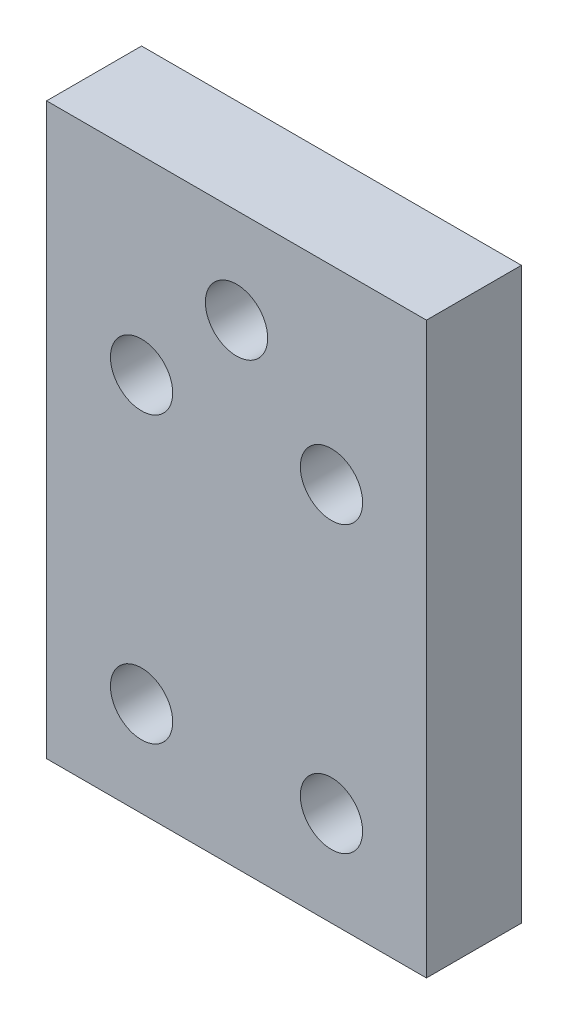
ISO-10303-21;
HEADER;
FILE_DESCRIPTION(('STEP AP214'),'2;1');
FILE_NAME('part.step','',(''),(''),'','','');
FILE_SCHEMA(('AUTOMOTIVE_DESIGN { 1 0 10303 214 1 1 1 1 }'));
ENDSEC;
DATA;
#1=APPLICATION_CONTEXT('core data for automotive mechanical design processes');
#2=APPLICATION_PROTOCOL_DEFINITION('international standard','automotive_design',2000,#1);
#3=PRODUCT_CONTEXT('',#1,'mechanical');
#4=PRODUCT('Part','Part','',(#3));
#5=PRODUCT_RELATED_PRODUCT_CATEGORY('part','',(#4));
#6=PRODUCT_DEFINITION_FORMATION('','',#4);
#7=PRODUCT_DEFINITION_CONTEXT('part definition',#1,'design');
#8=PRODUCT_DEFINITION('design','',#6,#7);
#9=PRODUCT_DEFINITION_SHAPE('','',#8);
#10=(LENGTH_UNIT() NAMED_UNIT(*) SI_UNIT(.MILLI.,.METRE.));
#11=(NAMED_UNIT(*) PLANE_ANGLE_UNIT() SI_UNIT($,.RADIAN.));
#12=(NAMED_UNIT(*) SI_UNIT($,.STERADIAN.) SOLID_ANGLE_UNIT());
#13=UNCERTAINTY_MEASURE_WITH_UNIT(LENGTH_MEASURE(1.E-05),#10,'distance_accuracy_value','');
#14=(GEOMETRIC_REPRESENTATION_CONTEXT(3) GLOBAL_UNCERTAINTY_ASSIGNED_CONTEXT((#13)) GLOBAL_UNIT_ASSIGNED_CONTEXT((#10,
#11,#12)) REPRESENTATION_CONTEXT('',''));
#15=CARTESIAN_POINT('',(0.,0.,0.));
#16=DIRECTION('',(0.,0.,1.));
#17=DIRECTION('',(1.,0.,0.));
#18=AXIS2_PLACEMENT_3D('',#15,#16,#17);
#19=CARTESIAN_POINT('',(0.,0.,6.35));
#20=DIRECTION('',(0.,0.,-1.));
#21=DIRECTION('',(-1.,0.,0.));
#22=AXIS2_PLACEMENT_3D('',#19,#20,#21);
#23=PLANE('',#22);
#24=DIRECTION('',(-1.,0.,0.));
#25=VECTOR('',#24,1.);
#26=CARTESIAN_POINT('',(0.,50.8,6.35));
#27=LINE('',#26,#25);
#28=CARTESIAN_POINT('',(25.4,50.8,6.35));
#29=VERTEX_POINT('',#28);
#30=CARTESIAN_POINT('',(0.,50.8,6.35));
#31=VERTEX_POINT('',#30);
#32=EDGE_CURVE('E85',#29,#31,#27,.T.);
#33=ORIENTED_EDGE('',*,*,#32,.T.);
#34=DIRECTION('',(0.,-1.,0.));
#35=VECTOR('',#34,1.);
#36=CARTESIAN_POINT('',(0.,12.7,6.35));
#37=LINE('',#36,#35);
#38=CARTESIAN_POINT('',(0.,12.7,6.35));
#39=VERTEX_POINT('',#38);
#40=EDGE_CURVE('E80',#31,#39,#37,.T.);
#41=ORIENTED_EDGE('',*,*,#40,.T.);
#42=DIRECTION('',(1.,0.,0.));
#43=VECTOR('',#42,1.);
#44=CARTESIAN_POINT('',(25.4,12.7,6.35));
#45=LINE('',#44,#43);
#46=CARTESIAN_POINT('',(25.4,12.7,6.35));
#47=VERTEX_POINT('',#46);
#48=EDGE_CURVE('E83',#39,#47,#45,.T.);
#49=ORIENTED_EDGE('',*,*,#48,.T.);
#50=DIRECTION('',(0.,1.,0.));
#51=VECTOR('',#50,1.);
#52=CARTESIAN_POINT('',(25.4,50.8,6.35));
#53=LINE('',#52,#51);
#54=EDGE_CURVE('E50',#47,#29,#53,.T.);
#55=ORIENTED_EDGE('',*,*,#54,.T.);
#56=EDGE_LOOP('',(#33,#41,#49,#55));
#57=FACE_BOUND('',#56,.T.);
#58=CARTESIAN_POINT('',(6.35,38.1,6.35));
#59=DIRECTION('',(0.,0.,1.));
#60=DIRECTION('',(1.,0.,0.));
#61=AXIS2_PLACEMENT_3D('',#58,#59,#60);
#62=CIRCLE('',#61,2.0828);
#63=CARTESIAN_POINT('',(8.4328,38.1,6.35));
#64=VERTEX_POINT('',#63);
#65=EDGE_CURVE('E100',#64,#64,#62,.T.);
#66=ORIENTED_EDGE('',*,*,#65,.F.);
#67=EDGE_LOOP('',(#66));
#68=FACE_BOUND('',#67,.T.);
#69=CARTESIAN_POINT('',(19.05,38.1,6.35));
#70=DIRECTION('',(0.,0.,1.));
#71=DIRECTION('',(-1.,0.,0.));
#72=AXIS2_PLACEMENT_3D('',#69,#70,#71);
#73=CIRCLE('',#72,2.0828);
#74=CARTESIAN_POINT('',(16.9672,38.1,6.35));
#75=VERTEX_POINT('',#74);
#76=EDGE_CURVE('E115',#75,#75,#73,.T.);
#77=ORIENTED_EDGE('',*,*,#76,.F.);
#78=EDGE_LOOP('',(#77));
#79=FACE_BOUND('',#78,.T.);
#80=CARTESIAN_POINT('',(6.35,19.05,6.35));
#81=DIRECTION('',(0.,0.,1.));
#82=DIRECTION('',(1.,0.,0.));
#83=AXIS2_PLACEMENT_3D('',#80,#81,#82);
#84=CIRCLE('',#83,2.0828);
#85=CARTESIAN_POINT('',(8.4328,19.05,6.35));
#86=VERTEX_POINT('',#85);
#87=EDGE_CURVE('E121',#86,#86,#84,.T.);
#88=ORIENTED_EDGE('',*,*,#87,.F.);
#89=EDGE_LOOP('',(#88));
#90=FACE_BOUND('',#89,.T.);
#91=CARTESIAN_POINT('',(12.7,44.45,6.35));
#92=DIRECTION('',(0.,0.,1.));
#93=DIRECTION('',(1.,0.,0.));
#94=AXIS2_PLACEMENT_3D('',#91,#92,#93);
#95=CIRCLE('',#94,2.0828);
#96=CARTESIAN_POINT('',(14.7828,44.45,6.35));
#97=VERTEX_POINT('',#96);
#98=EDGE_CURVE('E127',#97,#97,#95,.T.);
#99=ORIENTED_EDGE('',*,*,#98,.F.);
#100=EDGE_LOOP('',(#99));
#101=FACE_BOUND('',#100,.T.);
#102=CARTESIAN_POINT('',(19.05,19.05,6.35));
#103=DIRECTION('',(0.,0.,1.));
#104=DIRECTION('',(-1.,0.,0.));
#105=AXIS2_PLACEMENT_3D('',#102,#103,#104);
#106=CIRCLE('',#105,2.0828);
#107=CARTESIAN_POINT('',(16.9672,19.05,6.35));
#108=VERTEX_POINT('',#107);
#109=EDGE_CURVE('E133',#108,#108,#106,.T.);
#110=ORIENTED_EDGE('',*,*,#109,.F.);
#111=EDGE_LOOP('',(#110));
#112=FACE_BOUND('',#111,.T.);
#113=ADVANCED_FACE('F33',(#57,#68,#79,#90,#101,#112),#23,.F.);
#114=CARTESIAN_POINT('',(0.,0.,0.));
#115=DIRECTION('',(0.,0.,-1.));
#116=DIRECTION('',(-1.,0.,0.));
#117=AXIS2_PLACEMENT_3D('',#114,#115,#116);
#118=PLANE('',#117);
#119=CARTESIAN_POINT('',(12.7,44.45,0.));
#120=DIRECTION('',(0.,0.,1.));
#121=DIRECTION('',(1.,0.,0.));
#122=AXIS2_PLACEMENT_3D('',#119,#120,#121);
#123=CIRCLE('',#122,2.0828);
#124=CARTESIAN_POINT('',(14.7828,44.45,0.));
#125=VERTEX_POINT('',#124);
#126=EDGE_CURVE('E130',#125,#125,#123,.T.);
#127=ORIENTED_EDGE('',*,*,#126,.T.);
#128=EDGE_LOOP('',(#127));
#129=FACE_BOUND('',#128,.T.);
#130=CARTESIAN_POINT('',(19.05,38.1,0.));
#131=DIRECTION('',(0.,0.,1.));
#132=DIRECTION('',(-1.,0.,0.));
#133=AXIS2_PLACEMENT_3D('',#130,#131,#132);
#134=CIRCLE('',#133,2.0828);
#135=CARTESIAN_POINT('',(16.9672,38.1,0.));
#136=VERTEX_POINT('',#135);
#137=EDGE_CURVE('E118',#136,#136,#134,.T.);
#138=ORIENTED_EDGE('',*,*,#137,.T.);
#139=EDGE_LOOP('',(#138));
#140=FACE_BOUND('',#139,.T.);
#141=DIRECTION('',(-1.,0.,0.));
#142=VECTOR('',#141,1.);
#143=CARTESIAN_POINT('',(0.,50.8,0.));
#144=LINE('',#143,#142);
#145=CARTESIAN_POINT('',(25.4,50.8,0.));
#146=VERTEX_POINT('',#145);
#147=CARTESIAN_POINT('',(0.,50.8,0.));
#148=VERTEX_POINT('',#147);
#149=EDGE_CURVE('E97',#146,#148,#144,.T.);
#150=ORIENTED_EDGE('',*,*,#149,.F.);
#151=DIRECTION('',(0.,1.,0.));
#152=VECTOR('',#151,1.);
#153=CARTESIAN_POINT('',(25.4,50.8,0.));
#154=LINE('',#153,#152);
#155=CARTESIAN_POINT('',(25.4,12.7,0.));
#156=VERTEX_POINT('',#155);
#157=EDGE_CURVE('E73',#156,#146,#154,.T.);
#158=ORIENTED_EDGE('',*,*,#157,.F.);
#159=DIRECTION('',(1.,0.,0.));
#160=VECTOR('',#159,1.);
#161=CARTESIAN_POINT('',(25.4,12.7,0.));
#162=LINE('',#161,#160);
#163=CARTESIAN_POINT('',(0.,12.7,0.));
#164=VERTEX_POINT('',#163);
#165=EDGE_CURVE('E67',#164,#156,#162,.T.);
#166=ORIENTED_EDGE('',*,*,#165,.F.);
#167=DIRECTION('',(0.,-1.,0.));
#168=VECTOR('',#167,1.);
#169=CARTESIAN_POINT('',(0.,12.7,0.));
#170=LINE('',#169,#168);
#171=EDGE_CURVE('E89',#148,#164,#170,.T.);
#172=ORIENTED_EDGE('',*,*,#171,.F.);
#173=EDGE_LOOP('',(#150,#158,#166,#172));
#174=FACE_BOUND('',#173,.T.);
#175=CARTESIAN_POINT('',(6.35,38.1,0.));
#176=DIRECTION('',(0.,0.,1.));
#177=DIRECTION('',(1.,0.,0.));
#178=AXIS2_PLACEMENT_3D('',#175,#176,#177);
#179=CIRCLE('',#178,2.0828);
#180=CARTESIAN_POINT('',(8.4328,38.1,0.));
#181=VERTEX_POINT('',#180);
#182=EDGE_CURVE('E112',#181,#181,#179,.T.);
#183=ORIENTED_EDGE('',*,*,#182,.T.);
#184=EDGE_LOOP('',(#183));
#185=FACE_BOUND('',#184,.T.);
#186=CARTESIAN_POINT('',(6.35,19.05,0.));
#187=DIRECTION('',(0.,0.,1.));
#188=DIRECTION('',(1.,0.,0.));
#189=AXIS2_PLACEMENT_3D('',#186,#187,#188);
#190=CIRCLE('',#189,2.0828);
#191=CARTESIAN_POINT('',(8.4328,19.05,0.));
#192=VERTEX_POINT('',#191);
#193=EDGE_CURVE('E124',#192,#192,#190,.T.);
#194=ORIENTED_EDGE('',*,*,#193,.T.);
#195=EDGE_LOOP('',(#194));
#196=FACE_BOUND('',#195,.T.);
#197=CARTESIAN_POINT('',(19.05,19.05,0.));
#198=DIRECTION('',(0.,0.,1.));
#199=DIRECTION('',(-1.,0.,0.));
#200=AXIS2_PLACEMENT_3D('',#197,#198,#199);
#201=CIRCLE('',#200,2.0828);
#202=CARTESIAN_POINT('',(16.9672,19.05,0.));
#203=VERTEX_POINT('',#202);
#204=EDGE_CURVE('E136',#203,#203,#201,.T.);
#205=ORIENTED_EDGE('',*,*,#204,.T.);
#206=EDGE_LOOP('',(#205));
#207=FACE_BOUND('',#206,.T.);
#208=ADVANCED_FACE('F108',(#129,#140,#174,#185,#196,#207),#118,.T.);
#209=CARTESIAN_POINT('',(0.,50.8,6.35));
#210=DIRECTION('',(0.,-1.,0.));
#211=DIRECTION('',(0.,0.,-1.));
#212=AXIS2_PLACEMENT_3D('',#209,#210,#211);
#213=PLANE('',#212);
#214=ORIENTED_EDGE('',*,*,#149,.T.);
#215=DIRECTION('',(0.,0.,-1.));
#216=VECTOR('',#215,1.);
#217=CARTESIAN_POINT('',(0.,50.8,6.35));
#218=LINE('',#217,#216);
#219=EDGE_CURVE('E11',#31,#148,#218,.T.);
#220=ORIENTED_EDGE('',*,*,#219,.F.);
#221=ORIENTED_EDGE('',*,*,#32,.F.);
#222=DIRECTION('',(0.,0.,-1.));
#223=VECTOR('',#222,1.);
#224=CARTESIAN_POINT('',(25.4,50.8,6.35));
#225=LINE('',#224,#223);
#226=EDGE_CURVE('E93',#29,#146,#225,.T.);
#227=ORIENTED_EDGE('',*,*,#226,.T.);
#228=EDGE_LOOP('',(#214,#220,#221,#227));
#229=FACE_BOUND('',#228,.T.);
#230=ADVANCED_FACE('F35',(#229),#213,.F.);
#231=CARTESIAN_POINT('',(0.,12.7,6.35));
#232=DIRECTION('',(1.,0.,0.));
#233=DIRECTION('',(0.,0.,-1.));
#234=AXIS2_PLACEMENT_3D('',#231,#232,#233);
#235=PLANE('',#234);
#236=ORIENTED_EDGE('',*,*,#171,.T.);
#237=DIRECTION('',(0.,0.,-1.));
#238=VECTOR('',#237,1.);
#239=CARTESIAN_POINT('',(0.,12.7,6.35));
#240=LINE('',#239,#238);
#241=EDGE_CURVE('E42',#39,#164,#240,.T.);
#242=ORIENTED_EDGE('',*,*,#241,.F.);
#243=ORIENTED_EDGE('',*,*,#40,.F.);
#244=ORIENTED_EDGE('',*,*,#219,.T.);
#245=EDGE_LOOP('',(#236,#242,#243,#244));
#246=FACE_BOUND('',#245,.T.);
#247=ADVANCED_FACE('F88',(#246),#235,.F.);
#248=CARTESIAN_POINT('',(25.4,12.7,6.35));
#249=DIRECTION('',(0.,1.,0.));
#250=DIRECTION('',(0.,0.,1.));
#251=AXIS2_PLACEMENT_3D('',#248,#249,#250);
#252=PLANE('',#251);
#253=CARTESIAN_POINT('',(5.334,12.7,3.175));
#254=DIRECTION('',(0.,-1.,0.));
#255=DIRECTION('',(0.,0.,-1.));
#256=AXIS2_PLACEMENT_3D('',#253,#254,#255);
#257=CIRCLE('',#256,0.635000000000001);
#258=CARTESIAN_POINT('',(5.334,12.7,2.54));
#259=VERTEX_POINT('',#258);
#260=EDGE_CURVE('E148',#259,#259,#257,.T.);
#261=ORIENTED_EDGE('',*,*,#260,.F.);
#262=EDGE_LOOP('',(#261));
#263=FACE_BOUND('',#262,.T.);
#264=CARTESIAN_POINT('',(20.066,12.7,3.175));
#265=DIRECTION('',(0.,-1.,0.));
#266=DIRECTION('',(0.,0.,1.));
#267=AXIS2_PLACEMENT_3D('',#264,#265,#266);
#268=CIRCLE('',#267,0.635000000000002);
#269=CARTESIAN_POINT('',(20.066,12.7,3.81));
#270=VERTEX_POINT('',#269);
#271=EDGE_CURVE('E142',#270,#270,#268,.T.);
#272=ORIENTED_EDGE('',*,*,#271,.F.);
#273=EDGE_LOOP('',(#272));
#274=FACE_BOUND('',#273,.T.);
#275=ORIENTED_EDGE('',*,*,#165,.T.);
#276=DIRECTION('',(0.,0.,-1.));
#277=VECTOR('',#276,1.);
#278=CARTESIAN_POINT('',(25.4,12.7,6.35));
#279=LINE('',#278,#277);
#280=EDGE_CURVE('E90',#47,#156,#279,.T.);
#281=ORIENTED_EDGE('',*,*,#280,.F.);
#282=ORIENTED_EDGE('',*,*,#48,.F.);
#283=ORIENTED_EDGE('',*,*,#241,.T.);
#284=EDGE_LOOP('',(#275,#281,#282,#283));
#285=FACE_BOUND('',#284,.T.);
#286=ADVANCED_FACE('F91',(#263,#274,#285),#252,.F.);
#287=CARTESIAN_POINT('',(25.4,50.8,6.35));
#288=DIRECTION('',(-1.,0.,0.));
#289=DIRECTION('',(0.,-1.,0.));
#290=AXIS2_PLACEMENT_3D('',#287,#288,#289);
#291=PLANE('',#290);
#292=ORIENTED_EDGE('',*,*,#157,.T.);
#293=ORIENTED_EDGE('',*,*,#226,.F.);
#294=ORIENTED_EDGE('',*,*,#54,.F.);
#295=ORIENTED_EDGE('',*,*,#280,.T.);
#296=EDGE_LOOP('',(#292,#293,#294,#295));
#297=FACE_BOUND('',#296,.T.);
#298=ADVANCED_FACE('F105',(#297),#291,.F.);
#299=CARTESIAN_POINT('',(6.35,38.1,6.35));
#300=DIRECTION('',(0.,0.,-1.));
#301=DIRECTION('',(-1.,0.,0.));
#302=AXIS2_PLACEMENT_3D('',#299,#300,#301);
#303=CYLINDRICAL_SURFACE('',#302,2.0828);
#304=ORIENTED_EDGE('',*,*,#65,.T.);
#305=EDGE_LOOP('',(#304));
#306=FACE_BOUND('',#305,.T.);
#307=ORIENTED_EDGE('',*,*,#182,.F.);
#308=EDGE_LOOP('',(#307));
#309=FACE_BOUND('',#308,.T.);
#310=ADVANCED_FACE('F191',(#306,#309),#303,.F.);
#311=CARTESIAN_POINT('',(19.05,38.1,6.35));
#312=DIRECTION('',(0.,0.,-1.));
#313=DIRECTION('',(-1.,0.,0.));
#314=AXIS2_PLACEMENT_3D('',#311,#312,#313);
#315=CYLINDRICAL_SURFACE('',#314,2.0828);
#316=ORIENTED_EDGE('',*,*,#76,.T.);
#317=EDGE_LOOP('',(#316));
#318=FACE_BOUND('',#317,.T.);
#319=ORIENTED_EDGE('',*,*,#137,.F.);
#320=EDGE_LOOP('',(#319));
#321=FACE_BOUND('',#320,.T.);
#322=ADVANCED_FACE('F236',(#318,#321),#315,.F.);
#323=CARTESIAN_POINT('',(6.35,19.05,6.35));
#324=DIRECTION('',(0.,0.,-1.));
#325=DIRECTION('',(-1.,0.,0.));
#326=AXIS2_PLACEMENT_3D('',#323,#324,#325);
#327=CYLINDRICAL_SURFACE('',#326,2.0828);
#328=ORIENTED_EDGE('',*,*,#87,.T.);
#329=EDGE_LOOP('',(#328));
#330=FACE_BOUND('',#329,.T.);
#331=ORIENTED_EDGE('',*,*,#193,.F.);
#332=EDGE_LOOP('',(#331));
#333=FACE_BOUND('',#332,.T.);
#334=ADVANCED_FACE('F244',(#330,#333),#327,.F.);
#335=CARTESIAN_POINT('',(12.7,44.45,6.35));
#336=DIRECTION('',(0.,0.,-1.));
#337=DIRECTION('',(-1.,0.,0.));
#338=AXIS2_PLACEMENT_3D('',#335,#336,#337);
#339=CYLINDRICAL_SURFACE('',#338,2.0828);
#340=ORIENTED_EDGE('',*,*,#98,.T.);
#341=EDGE_LOOP('',(#340));
#342=FACE_BOUND('',#341,.T.);
#343=ORIENTED_EDGE('',*,*,#126,.F.);
#344=EDGE_LOOP('',(#343));
#345=FACE_BOUND('',#344,.T.);
#346=ADVANCED_FACE('F179',(#342,#345),#339,.F.);
#347=CARTESIAN_POINT('',(19.05,19.05,6.35));
#348=DIRECTION('',(0.,0.,-1.));
#349=DIRECTION('',(-1.,0.,0.));
#350=AXIS2_PLACEMENT_3D('',#347,#348,#349);
#351=CYLINDRICAL_SURFACE('',#350,2.0828);
#352=ORIENTED_EDGE('',*,*,#109,.T.);
#353=EDGE_LOOP('',(#352));
#354=FACE_BOUND('',#353,.T.);
#355=ORIENTED_EDGE('',*,*,#204,.F.);
#356=EDGE_LOOP('',(#355));
#357=FACE_BOUND('',#356,.T.);
#358=ADVANCED_FACE('F170',(#354,#357),#351,.F.);
#359=CARTESIAN_POINT('',(20.066,16.256,3.175));
#360=DIRECTION('',(0.,-1.,0.));
#361=DIRECTION('',(0.,0.,-1.));
#362=AXIS2_PLACEMENT_3D('',#359,#360,#361);
#363=CYLINDRICAL_SURFACE('',#362,0.635000000000002);
#364=CARTESIAN_POINT('',(20.066,16.256,3.175));
#365=DIRECTION('',(0.,-1.,0.));
#366=DIRECTION('',(0.,0.,1.));
#367=AXIS2_PLACEMENT_3D('',#364,#365,#366);
#368=CIRCLE('',#367,0.635000000000002);
#369=CARTESIAN_POINT('',(20.066,16.256,3.81));
#370=VERTEX_POINT('',#369);
#371=EDGE_CURVE('E139',#370,#370,#368,.T.);
#372=ORIENTED_EDGE('',*,*,#371,.F.);
#373=EDGE_LOOP('',(#372));
#374=FACE_BOUND('',#373,.T.);
#375=ORIENTED_EDGE('',*,*,#271,.T.);
#376=EDGE_LOOP('',(#375));
#377=FACE_BOUND('',#376,.T.);
#378=ADVANCED_FACE('F168',(#374,#377),#363,.F.);
#379=CARTESIAN_POINT('',(20.066,16.256,3.175));
#380=DIRECTION('',(0.,1.,0.));
#381=DIRECTION('',(0.,0.,1.));
#382=AXIS2_PLACEMENT_3D('',#379,#380,#381);
#383=PLANE('',#382);
#384=ORIENTED_EDGE('',*,*,#371,.T.);
#385=EDGE_LOOP('',(#384));
#386=FACE_BOUND('',#385,.T.);
#387=ADVANCED_FACE('F159',(#386),#383,.F.);
#388=CARTESIAN_POINT('',(5.334,16.256,3.175));
#389=DIRECTION('',(0.,-1.,0.));
#390=DIRECTION('',(0.,0.,-1.));
#391=AXIS2_PLACEMENT_3D('',#388,#389,#390);
#392=CYLINDRICAL_SURFACE('',#391,0.635000000000001);
#393=CARTESIAN_POINT('',(5.334,16.256,3.175));
#394=DIRECTION('',(0.,-1.,0.));
#395=DIRECTION('',(0.,0.,-1.));
#396=AXIS2_PLACEMENT_3D('',#393,#394,#395);
#397=CIRCLE('',#396,0.635000000000001);
#398=CARTESIAN_POINT('',(5.334,16.256,2.54));
#399=VERTEX_POINT('',#398);
#400=EDGE_CURVE('E145',#399,#399,#397,.T.);
#401=ORIENTED_EDGE('',*,*,#400,.F.);
#402=EDGE_LOOP('',(#401));
#403=FACE_BOUND('',#402,.T.);
#404=ORIENTED_EDGE('',*,*,#260,.T.);
#405=EDGE_LOOP('',(#404));
#406=FACE_BOUND('',#405,.T.);
#407=ADVANCED_FACE('F156',(#403,#406),#392,.F.);
#408=CARTESIAN_POINT('',(5.334,16.256,3.175));
#409=DIRECTION('',(0.,-1.,0.));
#410=DIRECTION('',(0.,0.,-1.));
#411=AXIS2_PLACEMENT_3D('',#408,#409,#410);
#412=PLANE('',#411);
#413=ORIENTED_EDGE('',*,*,#400,.T.);
#414=EDGE_LOOP('',(#413));
#415=FACE_BOUND('',#414,.T.);
#416=ADVANCED_FACE('F154',(#415),#412,.T.);
#417=CLOSED_SHELL('',(#113,#208,#230,#247,#286,#298,#310,#322,#334,#346,#358,#378,#387,#407,#416));
#418=MANIFOLD_SOLID_BREP('B2',#417);
#419=ADVANCED_BREP_SHAPE_REPRESENTATION('',(#18,#418),#14);
#420=SHAPE_DEFINITION_REPRESENTATION(#9,#419);
ENDSEC;
END-ISO-10303-21;
